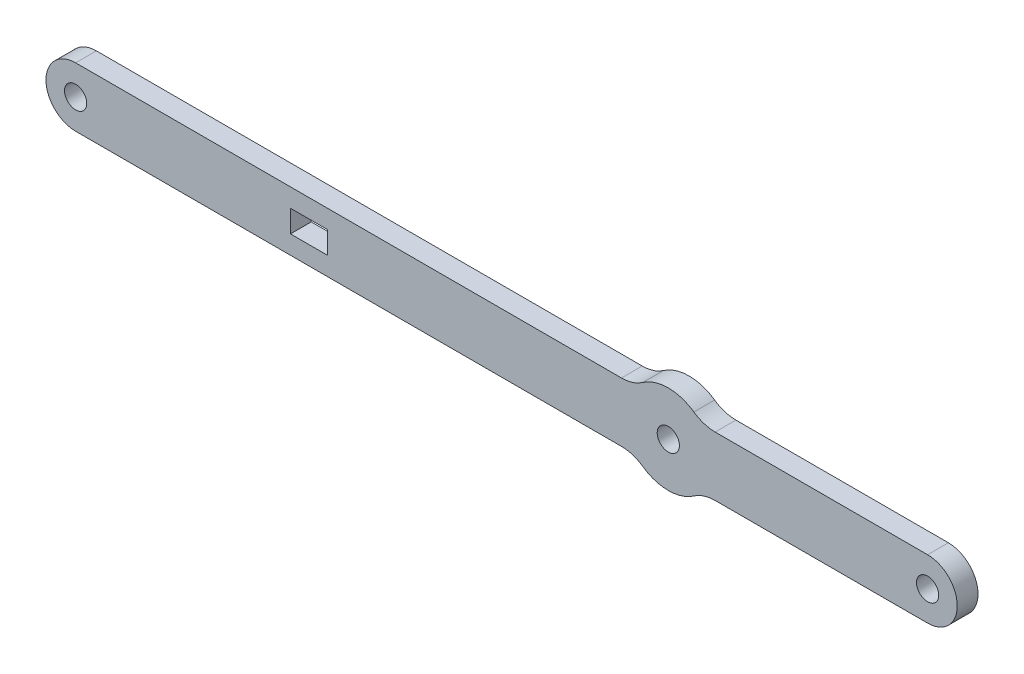
ISO-10303-21;
HEADER;
FILE_DESCRIPTION(('STEP AP214'),'2;1');
FILE_NAME('part.step','',(''),(''),'','','');
FILE_SCHEMA(('AUTOMOTIVE_DESIGN { 1 0 10303 214 1 1 1 1 }'));
ENDSEC;
DATA;
#1=APPLICATION_CONTEXT('core data for automotive mechanical design processes');
#2=APPLICATION_PROTOCOL_DEFINITION('international standard','automotive_design',2000,#1);
#3=PRODUCT_CONTEXT('',#1,'mechanical');
#4=PRODUCT('Part','Part','',(#3));
#5=PRODUCT_RELATED_PRODUCT_CATEGORY('part','',(#4));
#6=PRODUCT_DEFINITION_FORMATION('','',#4);
#7=PRODUCT_DEFINITION_CONTEXT('part definition',#1,'design');
#8=PRODUCT_DEFINITION('design','',#6,#7);
#9=PRODUCT_DEFINITION_SHAPE('','',#8);
#10=(LENGTH_UNIT() NAMED_UNIT(*) SI_UNIT(.MILLI.,.METRE.));
#11=(NAMED_UNIT(*) PLANE_ANGLE_UNIT() SI_UNIT($,.RADIAN.));
#12=(NAMED_UNIT(*) SI_UNIT($,.STERADIAN.) SOLID_ANGLE_UNIT());
#13=UNCERTAINTY_MEASURE_WITH_UNIT(LENGTH_MEASURE(1.E-05),#10,'distance_accuracy_value','');
#14=(GEOMETRIC_REPRESENTATION_CONTEXT(3) GLOBAL_UNCERTAINTY_ASSIGNED_CONTEXT((#13)) GLOBAL_UNIT_ASSIGNED_CONTEXT((#10,
#11,#12)) REPRESENTATION_CONTEXT('',''));
#15=CARTESIAN_POINT('',(0.,0.,0.));
#16=DIRECTION('',(0.,0.,1.));
#17=DIRECTION('',(1.,0.,0.));
#18=AXIS2_PLACEMENT_3D('',#15,#16,#17);
#19=CARTESIAN_POINT('',(0.,0.,2.8));
#20=DIRECTION('',(0.,0.,1.));
#21=DIRECTION('',(1.,0.,0.));
#22=AXIS2_PLACEMENT_3D('',#19,#20,#21);
#23=PLANE('',#22);
#24=CARTESIAN_POINT('',(115.,0.,2.8));
#25=DIRECTION('',(0.,0.,1.));
#26=DIRECTION('',(1.,0.,0.));
#27=AXIS2_PLACEMENT_3D('',#24,#25,#26);
#28=CIRCLE('',#27,1.5);
#29=CARTESIAN_POINT('',(116.5,0.,2.8));
#30=VERTEX_POINT('',#29);
#31=EDGE_CURVE('E196',#30,#30,#28,.T.);
#32=ORIENTED_EDGE('',*,*,#31,.F.);
#33=EDGE_LOOP('',(#32));
#34=FACE_BOUND('',#33,.T.);
#35=CARTESIAN_POINT('',(0.,0.,2.8));
#36=DIRECTION('',(0.,0.,1.));
#37=DIRECTION('',(1.,0.,0.));
#38=AXIS2_PLACEMENT_3D('',#35,#36,#37);
#39=CIRCLE('',#38,4.0000055179048);
#40=CARTESIAN_POINT('',(0.00617437826342593,4.00000075254017,2.8));
#41=VERTEX_POINT('',#40);
#42=CARTESIAN_POINT('',(-0.00708267489475927,-3.99999924737308,2.8));
#43=VERTEX_POINT('',#42);
#44=EDGE_CURVE('E208',#41,#43,#39,.T.);
#45=ORIENTED_EDGE('',*,*,#44,.T.);
#46=DIRECTION('',(1.,-6.54439458712643E-09,0.));
#47=VECTOR('',#46,1.);
#48=CARTESIAN_POINT('',(-0.00708267489475927,-3.99999924737308,2.8));
#49=LINE('',#48,#47);
#50=CARTESIAN_POINT('',(73.6754443275717,-3.99999972958061,2.8));
#51=VERTEX_POINT('',#50);
#52=EDGE_CURVE('E211',#43,#51,#49,.T.);
#53=ORIENTED_EDGE('',*,*,#52,.T.);
#54=CARTESIAN_POINT('',(73.6754442948497,-8.99999972958061,2.8));
#55=DIRECTION('',(0.,0.,1.));
#56=DIRECTION('',(1.,0.,0.));
#57=AXIS2_PLACEMENT_3D('',#54,#55,#56);
#58=CIRCLE('',#57,5.);
#59=CARTESIAN_POINT('',(76.5502423426453,-4.90909076158942,2.8));
#60=VERTEX_POINT('',#59);
#61=EDGE_CURVE('E284',#51,#60,#58,.F.);
#62=ORIENTED_EDGE('',*,*,#61,.T.);
#63=CARTESIAN_POINT('',(80.,0.,2.8));
#64=DIRECTION('',(0.,0.,1.));
#65=DIRECTION('',(1.,0.,0.));
#66=AXIS2_PLACEMENT_3D('',#63,#64,#65);
#67=CIRCLE('',#66,6.);
#68=CARTESIAN_POINT('',(83.4497575931007,-4.90909080674257,2.8));
#69=VERTEX_POINT('',#68);
#70=EDGE_CURVE('E215',#60,#69,#67,.T.);
#71=ORIENTED_EDGE('',*,*,#70,.T.);
#72=CARTESIAN_POINT('',(86.3245555873512,-8.99999981236138,2.8));
#73=DIRECTION('',(0.,0.,1.));
#74=DIRECTION('',(1.,0.,0.));
#75=AXIS2_PLACEMENT_3D('',#72,#73,#74);
#76=CIRCLE('',#75,5.);
#77=CARTESIAN_POINT('',(86.3245556200732,-3.99999981236138,2.8));
#78=VERTEX_POINT('',#77);
#79=EDGE_CURVE('E280',#69,#78,#76,.F.);
#80=ORIENTED_EDGE('',*,*,#79,.T.);
#81=DIRECTION('',(1.,-6.54439462257202E-09,0.));
#82=VECTOR('',#81,1.);
#83=CARTESIAN_POINT('',(84.4721361336718,-3.99999980023842,2.8));
#84=LINE('',#83,#82);
#85=CARTESIAN_POINT('',(114.999999973822,-4.,2.8));
#86=VERTEX_POINT('',#85);
#87=EDGE_CURVE('E218',#78,#86,#84,.T.);
#88=ORIENTED_EDGE('',*,*,#87,.T.);
#89=CARTESIAN_POINT('',(115.,0.,2.8));
#90=DIRECTION('',(0.,0.,1.));
#91=DIRECTION('',(1.,0.,0.));
#92=AXIS2_PLACEMENT_3D('',#89,#90,#91);
#93=CIRCLE('',#92,4.);
#94=CARTESIAN_POINT('',(115.000000078533,3.99999999997519,2.8));
#95=VERTEX_POINT('',#94);
#96=EDGE_CURVE('E220',#86,#95,#93,.T.);
#97=ORIENTED_EDGE('',*,*,#96,.T.);
#98=DIRECTION('',(-1.,6.54439460875569E-09,0.));
#99=VECTOR('',#98,1.);
#100=CARTESIAN_POINT('',(84.4721357763274,4.00000019976158,2.8));
#101=LINE('',#100,#99);
#102=CARTESIAN_POINT('',(86.3245550206003,4.00000018763862,2.8));
#103=VERTEX_POINT('',#102);
#104=EDGE_CURVE('E222',#95,#103,#101,.T.);
#105=ORIENTED_EDGE('',*,*,#104,.T.);
#106=CARTESIAN_POINT('',(86.3245550533223,9.00000018763862,2.8));
#107=DIRECTION('',(0.,0.,1.));
#108=DIRECTION('',(1.,0.,0.));
#109=AXIS2_PLACEMENT_3D('',#106,#107,#108);
#110=CIRCLE('',#109,5.);
#111=CARTESIAN_POINT('',(83.4497573018122,4.90909101143925,2.8));
#112=VERTEX_POINT('',#111);
#113=EDGE_CURVE('E11',#103,#112,#110,.F.);
#114=ORIENTED_EDGE('',*,*,#113,.T.);
#115=CARTESIAN_POINT('',(80.,0.,2.8));
#116=DIRECTION('',(0.,0.,1.));
#117=DIRECTION('',(1.,0.,0.));
#118=AXIS2_PLACEMENT_3D('',#115,#116,#117);
#119=CIRCLE('',#118,6.00000000000001);
#120=CARTESIAN_POINT('',(76.5502427624419,4.90909105659239,2.8));
#121=VERTEX_POINT('',#120);
#122=EDGE_CURVE('E224',#112,#121,#119,.T.);
#123=ORIENTED_EDGE('',*,*,#122,.T.);
#124=CARTESIAN_POINT('',(73.6754450644768,9.00000027041939,2.8));
#125=DIRECTION('',(0.,0.,1.));
#126=DIRECTION('',(1.,0.,0.));
#127=AXIS2_PLACEMENT_3D('',#124,#125,#126);
#128=CIRCLE('',#127,5.);
#129=CARTESIAN_POINT('',(73.6754450317548,4.00000027041939,2.8));
#130=VERTEX_POINT('',#129);
#131=EDGE_CURVE('E288',#121,#130,#128,.F.);
#132=ORIENTED_EDGE('',*,*,#131,.T.);
#133=DIRECTION('',(-1.,6.54439461327344E-09,0.));
#134=VECTOR('',#133,1.);
#135=CARTESIAN_POINT('',(0.00617437826342593,4.00000075254017,2.8));
#136=LINE('',#135,#134);
#137=EDGE_CURVE('E227',#130,#41,#136,.T.);
#138=ORIENTED_EDGE('',*,*,#137,.T.);
#139=EDGE_LOOP('',(#45,#53,#62,#71,#80,#88,#97,#105,#114,#123,#132,#138));
#140=FACE_BOUND('',#139,.T.);
#141=CARTESIAN_POINT('',(80.,0.,2.8));
#142=DIRECTION('',(0.,0.,1.));
#143=DIRECTION('',(1.,0.,0.));
#144=AXIS2_PLACEMENT_3D('',#141,#142,#143);
#145=CIRCLE('',#144,1.5);
#146=CARTESIAN_POINT('',(81.5,0.,2.8));
#147=VERTEX_POINT('',#146);
#148=EDGE_CURVE('E202',#147,#147,#145,.T.);
#149=ORIENTED_EDGE('',*,*,#148,.F.);
#150=EDGE_LOOP('',(#149));
#151=FACE_BOUND('',#150,.T.);
#152=CARTESIAN_POINT('',(0.,0.,2.8));
#153=DIRECTION('',(0.,0.,1.));
#154=DIRECTION('',(1.,0.,0.));
#155=AXIS2_PLACEMENT_3D('',#152,#153,#154);
#156=CIRCLE('',#155,1.5);
#157=CARTESIAN_POINT('',(1.5,0.,2.8));
#158=VERTEX_POINT('',#157);
#159=EDGE_CURVE('E190',#158,#158,#156,.T.);
#160=ORIENTED_EDGE('',*,*,#159,.F.);
#161=EDGE_LOOP('',(#160));
#162=FACE_BOUND('',#161,.T.);
#163=DIRECTION('',(-1.,0.,0.));
#164=VECTOR('',#163,1.);
#165=CARTESIAN_POINT('',(28.999999974262,1.5,2.8));
#166=LINE('',#165,#164);
#167=CARTESIAN_POINT('',(33.999999974262,1.5,2.8));
#168=VERTEX_POINT('',#167);
#169=CARTESIAN_POINT('',(28.999999974262,1.5,2.8));
#170=VERTEX_POINT('',#169);
#171=EDGE_CURVE('E159',#168,#170,#166,.T.);
#172=ORIENTED_EDGE('',*,*,#171,.F.);
#173=DIRECTION('',(0.,1.,0.));
#174=VECTOR('',#173,1.);
#175=CARTESIAN_POINT('',(33.999999974262,-1.5,2.8));
#176=LINE('',#175,#174);
#177=CARTESIAN_POINT('',(33.999999974262,-1.5,2.8));
#178=VERTEX_POINT('',#177);
#179=EDGE_CURVE('E149',#178,#168,#176,.T.);
#180=ORIENTED_EDGE('',*,*,#179,.F.);
#181=DIRECTION('',(1.,0.,0.));
#182=VECTOR('',#181,1.);
#183=CARTESIAN_POINT('',(28.999999974262,-1.5,2.8));
#184=LINE('',#183,#182);
#185=CARTESIAN_POINT('',(28.999999974262,-1.5,2.8));
#186=VERTEX_POINT('',#185);
#187=EDGE_CURVE('E174',#186,#178,#184,.T.);
#188=ORIENTED_EDGE('',*,*,#187,.F.);
#189=DIRECTION('',(0.,-1.,0.));
#190=VECTOR('',#189,1.);
#191=CARTESIAN_POINT('',(28.999999974262,-1.5,2.8));
#192=LINE('',#191,#190);
#193=EDGE_CURVE('E172',#170,#186,#192,.T.);
#194=ORIENTED_EDGE('',*,*,#193,.F.);
#195=EDGE_LOOP('',(#172,#180,#188,#194));
#196=FACE_BOUND('',#195,.T.);
#197=ADVANCED_FACE('F35',(#34,#140,#151,#162,#196),#23,.T.);
#198=CARTESIAN_POINT('',(0.,0.,0.));
#199=DIRECTION('',(0.,0.,1.));
#200=DIRECTION('',(1.,0.,0.));
#201=AXIS2_PLACEMENT_3D('',#198,#199,#200);
#202=PLANE('',#201);
#203=CARTESIAN_POINT('',(0.,0.,0.));
#204=DIRECTION('',(0.,0.,1.));
#205=DIRECTION('',(1.,0.,0.));
#206=AXIS2_PLACEMENT_3D('',#203,#204,#205);
#207=CIRCLE('',#206,1.5);
#208=CARTESIAN_POINT('',(1.5,0.,0.));
#209=VERTEX_POINT('',#208);
#210=EDGE_CURVE('E167',#209,#209,#207,.T.);
#211=ORIENTED_EDGE('',*,*,#210,.T.);
#212=EDGE_LOOP('',(#211));
#213=FACE_BOUND('',#212,.T.);
#214=CARTESIAN_POINT('',(115.,0.,0.));
#215=DIRECTION('',(0.,0.,1.));
#216=DIRECTION('',(1.,0.,0.));
#217=AXIS2_PLACEMENT_3D('',#214,#215,#216);
#218=CIRCLE('',#217,1.5);
#219=CARTESIAN_POINT('',(116.5,0.,0.));
#220=VERTEX_POINT('',#219);
#221=EDGE_CURVE('E193',#220,#220,#218,.T.);
#222=ORIENTED_EDGE('',*,*,#221,.T.);
#223=EDGE_LOOP('',(#222));
#224=FACE_BOUND('',#223,.T.);
#225=CARTESIAN_POINT('',(80.,0.,0.));
#226=DIRECTION('',(0.,0.,1.));
#227=DIRECTION('',(1.,0.,0.));
#228=AXIS2_PLACEMENT_3D('',#225,#226,#227);
#229=CIRCLE('',#228,1.5);
#230=CARTESIAN_POINT('',(81.5,0.,0.));
#231=VERTEX_POINT('',#230);
#232=EDGE_CURVE('E199',#231,#231,#229,.T.);
#233=ORIENTED_EDGE('',*,*,#232,.T.);
#234=EDGE_LOOP('',(#233));
#235=FACE_BOUND('',#234,.T.);
#236=CARTESIAN_POINT('',(0.,0.,0.));
#237=DIRECTION('',(0.,0.,1.));
#238=DIRECTION('',(1.,0.,0.));
#239=AXIS2_PLACEMENT_3D('',#236,#237,#238);
#240=CIRCLE('',#239,4.0000055179048);
#241=CARTESIAN_POINT('',(0.00617437826342593,4.00000075254017,0.));
#242=VERTEX_POINT('',#241);
#243=CARTESIAN_POINT('',(-0.00708267489475927,-3.99999924737308,0.));
#244=VERTEX_POINT('',#243);
#245=EDGE_CURVE('E205',#242,#244,#240,.T.);
#246=ORIENTED_EDGE('',*,*,#245,.F.);
#247=DIRECTION('',(-1.,6.54439461327344E-09,0.));
#248=VECTOR('',#247,1.);
#249=CARTESIAN_POINT('',(0.00617437826342593,4.00000075254017,0.));
#250=LINE('',#249,#248);
#251=CARTESIAN_POINT('',(73.6754450317548,4.00000027041939,0.));
#252=VERTEX_POINT('',#251);
#253=EDGE_CURVE('E212',#252,#242,#250,.T.);
#254=ORIENTED_EDGE('',*,*,#253,.F.);
#255=CARTESIAN_POINT('',(73.6754450644768,9.00000027041939,0.));
#256=DIRECTION('',(0.,0.,1.));
#257=DIRECTION('',(1.,0.,0.));
#258=AXIS2_PLACEMENT_3D('',#255,#256,#257);
#259=CIRCLE('',#258,5.);
#260=CARTESIAN_POINT('',(76.5502427624419,4.90909105659239,0.));
#261=VERTEX_POINT('',#260);
#262=EDGE_CURVE('E286',#252,#261,#259,.T.);
#263=ORIENTED_EDGE('',*,*,#262,.T.);
#264=CARTESIAN_POINT('',(80.,0.,0.));
#265=DIRECTION('',(0.,0.,1.));
#266=DIRECTION('',(1.,0.,0.));
#267=AXIS2_PLACEMENT_3D('',#264,#265,#266);
#268=CIRCLE('',#267,6.00000000000001);
#269=CARTESIAN_POINT('',(83.4497573018122,4.90909101143925,0.));
#270=VERTEX_POINT('',#269);
#271=EDGE_CURVE('E244',#270,#261,#268,.T.);
#272=ORIENTED_EDGE('',*,*,#271,.F.);
#273=CARTESIAN_POINT('',(86.3245550533223,9.00000018763862,0.));
#274=DIRECTION('',(0.,0.,1.));
#275=DIRECTION('',(1.,0.,0.));
#276=AXIS2_PLACEMENT_3D('',#273,#274,#275);
#277=CIRCLE('',#276,5.);
#278=CARTESIAN_POINT('',(86.3245550206003,4.00000018763862,0.));
#279=VERTEX_POINT('',#278);
#280=EDGE_CURVE('E43',#270,#279,#277,.T.);
#281=ORIENTED_EDGE('',*,*,#280,.T.);
#282=DIRECTION('',(-1.,6.54439460875569E-09,0.));
#283=VECTOR('',#282,1.);
#284=CARTESIAN_POINT('',(84.4721357763274,4.00000019976158,0.));
#285=LINE('',#284,#283);
#286=CARTESIAN_POINT('',(115.000000078533,3.99999999997519,0.));
#287=VERTEX_POINT('',#286);
#288=EDGE_CURVE('E242',#287,#279,#285,.T.);
#289=ORIENTED_EDGE('',*,*,#288,.F.);
#290=CARTESIAN_POINT('',(115.,0.,0.));
#291=DIRECTION('',(0.,0.,1.));
#292=DIRECTION('',(1.,0.,0.));
#293=AXIS2_PLACEMENT_3D('',#290,#291,#292);
#294=CIRCLE('',#293,4.);
#295=CARTESIAN_POINT('',(114.999999973822,-4.,0.));
#296=VERTEX_POINT('',#295);
#297=EDGE_CURVE('E240',#296,#287,#294,.T.);
#298=ORIENTED_EDGE('',*,*,#297,.F.);
#299=DIRECTION('',(1.,-6.54439462257202E-09,0.));
#300=VECTOR('',#299,1.);
#301=CARTESIAN_POINT('',(84.4721361336718,-3.99999980023842,0.));
#302=LINE('',#301,#300);
#303=CARTESIAN_POINT('',(86.3245556200732,-3.99999981236138,0.));
#304=VERTEX_POINT('',#303);
#305=EDGE_CURVE('E238',#304,#296,#302,.T.);
#306=ORIENTED_EDGE('',*,*,#305,.F.);
#307=CARTESIAN_POINT('',(86.3245555873512,-8.99999981236138,0.));
#308=DIRECTION('',(0.,0.,1.));
#309=DIRECTION('',(1.,0.,0.));
#310=AXIS2_PLACEMENT_3D('',#307,#308,#309);
#311=CIRCLE('',#310,5.);
#312=CARTESIAN_POINT('',(83.4497575931007,-4.90909080674257,0.));
#313=VERTEX_POINT('',#312);
#314=EDGE_CURVE('E278',#304,#313,#311,.T.);
#315=ORIENTED_EDGE('',*,*,#314,.T.);
#316=CARTESIAN_POINT('',(80.,0.,0.));
#317=DIRECTION('',(0.,0.,1.));
#318=DIRECTION('',(1.,0.,0.));
#319=AXIS2_PLACEMENT_3D('',#316,#317,#318);
#320=CIRCLE('',#319,6.);
#321=CARTESIAN_POINT('',(76.5502423426453,-4.90909076158942,0.));
#322=VERTEX_POINT('',#321);
#323=EDGE_CURVE('E235',#322,#313,#320,.T.);
#324=ORIENTED_EDGE('',*,*,#323,.F.);
#325=CARTESIAN_POINT('',(73.6754442948497,-8.99999972958061,0.));
#326=DIRECTION('',(0.,0.,1.));
#327=DIRECTION('',(1.,0.,0.));
#328=AXIS2_PLACEMENT_3D('',#325,#326,#327);
#329=CIRCLE('',#328,5.);
#330=CARTESIAN_POINT('',(73.6754443275717,-3.99999972958061,0.));
#331=VERTEX_POINT('',#330);
#332=EDGE_CURVE('E282',#322,#331,#329,.T.);
#333=ORIENTED_EDGE('',*,*,#332,.T.);
#334=DIRECTION('',(1.,-6.54439458712643E-09,0.));
#335=VECTOR('',#334,1.);
#336=CARTESIAN_POINT('',(-0.00708267489475927,-3.99999924737308,0.));
#337=LINE('',#336,#335);
#338=EDGE_CURVE('E232',#244,#331,#337,.T.);
#339=ORIENTED_EDGE('',*,*,#338,.F.);
#340=EDGE_LOOP('',(#246,#254,#263,#272,#281,#289,#298,#306,#315,#324,#333,#339));
#341=FACE_BOUND('',#340,.T.);
#342=DIRECTION('',(0.,1.,0.));
#343=VECTOR('',#342,1.);
#344=CARTESIAN_POINT('',(33.999999974262,-1.5,0.));
#345=LINE('',#344,#343);
#346=CARTESIAN_POINT('',(33.999999974262,-1.5,0.));
#347=VERTEX_POINT('',#346);
#348=CARTESIAN_POINT('',(33.999999974262,1.5,0.));
#349=VERTEX_POINT('',#348);
#350=EDGE_CURVE('E178',#347,#349,#345,.T.);
#351=ORIENTED_EDGE('',*,*,#350,.T.);
#352=DIRECTION('',(-1.,0.,0.));
#353=VECTOR('',#352,1.);
#354=CARTESIAN_POINT('',(28.999999974262,1.5,0.));
#355=LINE('',#354,#353);
#356=CARTESIAN_POINT('',(28.999999974262,1.5,0.));
#357=VERTEX_POINT('',#356);
#358=EDGE_CURVE('E166',#349,#357,#355,.T.);
#359=ORIENTED_EDGE('',*,*,#358,.T.);
#360=DIRECTION('',(0.,-1.,0.));
#361=VECTOR('',#360,1.);
#362=CARTESIAN_POINT('',(28.999999974262,-1.5,0.));
#363=LINE('',#362,#361);
#364=CARTESIAN_POINT('',(28.999999974262,-1.5,0.));
#365=VERTEX_POINT('',#364);
#366=EDGE_CURVE('E181',#357,#365,#363,.T.);
#367=ORIENTED_EDGE('',*,*,#366,.T.);
#368=DIRECTION('',(1.,0.,0.));
#369=VECTOR('',#368,1.);
#370=CARTESIAN_POINT('',(28.999999974262,-1.5,0.));
#371=LINE('',#370,#369);
#372=EDGE_CURVE('E160',#365,#347,#371,.T.);
#373=ORIENTED_EDGE('',*,*,#372,.T.);
#374=EDGE_LOOP('',(#351,#359,#367,#373));
#375=FACE_BOUND('',#374,.T.);
#376=ADVANCED_FACE('F304',(#213,#224,#235,#341,#375),#202,.F.);
#377=CARTESIAN_POINT('',(0.,0.,2.8));
#378=DIRECTION('',(0.,0.,-1.));
#379=DIRECTION('',(-1.,0.,0.));
#380=AXIS2_PLACEMENT_3D('',#377,#378,#379);
#381=CYLINDRICAL_SURFACE('',#380,4.0000055179048);
#382=ORIENTED_EDGE('',*,*,#245,.T.);
#383=DIRECTION('',(0.,0.,-1.));
#384=VECTOR('',#383,1.);
#385=CARTESIAN_POINT('',(-0.00708267489475927,-3.99999924737308,2.8));
#386=LINE('',#385,#384);
#387=EDGE_CURVE('E256',#43,#244,#386,.T.);
#388=ORIENTED_EDGE('',*,*,#387,.F.);
#389=ORIENTED_EDGE('',*,*,#44,.F.);
#390=DIRECTION('',(0.,0.,-1.));
#391=VECTOR('',#390,1.);
#392=CARTESIAN_POINT('',(0.00617437826342593,4.00000075254017,2.8));
#393=LINE('',#392,#391);
#394=EDGE_CURVE('E229',#41,#242,#393,.T.);
#395=ORIENTED_EDGE('',*,*,#394,.T.);
#396=EDGE_LOOP('',(#382,#388,#389,#395));
#397=FACE_BOUND('',#396,.T.);
#398=ADVANCED_FACE('F340',(#397),#381,.T.);
#399=CARTESIAN_POINT('',(-0.00708267489475927,-3.99999924737308,2.8));
#400=DIRECTION('',(6.54439458712643E-09,1.,0.));
#401=DIRECTION('',(-1.,6.54439458712643E-09,0.));
#402=AXIS2_PLACEMENT_3D('',#399,#400,#401);
#403=PLANE('',#402);
#404=ORIENTED_EDGE('',*,*,#338,.T.);
#405=DIRECTION('',(0.,0.,1.));
#406=VECTOR('',#405,1.);
#407=CARTESIAN_POINT('',(73.6754443275717,-3.99999972958061,2.8));
#408=LINE('',#407,#406);
#409=EDGE_CURVE('E267',#331,#51,#408,.T.);
#410=ORIENTED_EDGE('',*,*,#409,.T.);
#411=ORIENTED_EDGE('',*,*,#52,.F.);
#412=ORIENTED_EDGE('',*,*,#387,.T.);
#413=EDGE_LOOP('',(#404,#410,#411,#412));
#414=FACE_BOUND('',#413,.T.);
#415=ADVANCED_FACE('F337',(#414),#403,.F.);
#416=CARTESIAN_POINT('',(80.,0.,2.8));
#417=DIRECTION('',(0.,0.,-1.));
#418=DIRECTION('',(-1.,0.,0.));
#419=AXIS2_PLACEMENT_3D('',#416,#417,#418);
#420=CYLINDRICAL_SURFACE('',#419,6.);
#421=ORIENTED_EDGE('',*,*,#323,.T.);
#422=DIRECTION('',(0.,0.,-1.));
#423=VECTOR('',#422,1.);
#424=CARTESIAN_POINT('',(83.4497575931007,-4.90909080674258,2.8));
#425=LINE('',#424,#423);
#426=EDGE_CURVE('E265',#313,#69,#425,.F.);
#427=ORIENTED_EDGE('',*,*,#426,.T.);
#428=ORIENTED_EDGE('',*,*,#70,.F.);
#429=DIRECTION('',(0.,0.,-1.));
#430=VECTOR('',#429,1.);
#431=CARTESIAN_POINT('',(76.5502423426453,-4.90909076158942,2.8));
#432=LINE('',#431,#430);
#433=EDGE_CURVE('E262',#60,#322,#432,.T.);
#434=ORIENTED_EDGE('',*,*,#433,.T.);
#435=EDGE_LOOP('',(#421,#427,#428,#434));
#436=FACE_BOUND('',#435,.T.);
#437=ADVANCED_FACE('F329',(#436),#420,.T.);
#438=CARTESIAN_POINT('',(84.4721361336718,-3.99999980023842,2.8));
#439=DIRECTION('',(6.54439462257202E-09,1.,0.));
#440=DIRECTION('',(-1.,6.54439462257202E-09,0.));
#441=AXIS2_PLACEMENT_3D('',#438,#439,#440);
#442=PLANE('',#441);
#443=ORIENTED_EDGE('',*,*,#87,.F.);
#444=DIRECTION('',(0.,0.,1.));
#445=VECTOR('',#444,1.);
#446=CARTESIAN_POINT('',(86.3245556200732,-3.99999981236138,0.));
#447=LINE('',#446,#445);
#448=EDGE_CURVE('E259',#78,#304,#447,.F.);
#449=ORIENTED_EDGE('',*,*,#448,.T.);
#450=ORIENTED_EDGE('',*,*,#305,.T.);
#451=DIRECTION('',(0.,0.,-1.));
#452=VECTOR('',#451,1.);
#453=CARTESIAN_POINT('',(114.999999973822,-4.,2.8));
#454=LINE('',#453,#452);
#455=EDGE_CURVE('E253',#86,#296,#454,.T.);
#456=ORIENTED_EDGE('',*,*,#455,.F.);
#457=EDGE_LOOP('',(#443,#449,#450,#456));
#458=FACE_BOUND('',#457,.T.);
#459=ADVANCED_FACE('F321',(#458),#442,.F.);
#460=CARTESIAN_POINT('',(115.,0.,2.8));
#461=DIRECTION('',(0.,0.,-1.));
#462=DIRECTION('',(-1.,0.,0.));
#463=AXIS2_PLACEMENT_3D('',#460,#461,#462);
#464=CYLINDRICAL_SURFACE('',#463,4.);
#465=ORIENTED_EDGE('',*,*,#297,.T.);
#466=DIRECTION('',(0.,0.,-1.));
#467=VECTOR('',#466,1.);
#468=CARTESIAN_POINT('',(115.000000078533,3.99999999997519,2.8));
#469=LINE('',#468,#467);
#470=EDGE_CURVE('E250',#95,#287,#469,.T.);
#471=ORIENTED_EDGE('',*,*,#470,.F.);
#472=ORIENTED_EDGE('',*,*,#96,.F.);
#473=ORIENTED_EDGE('',*,*,#455,.T.);
#474=EDGE_LOOP('',(#465,#471,#472,#473));
#475=FACE_BOUND('',#474,.T.);
#476=ADVANCED_FACE('F317',(#475),#464,.T.);
#477=CARTESIAN_POINT('',(84.4721357763274,4.00000019976158,2.8));
#478=DIRECTION('',(-6.54439460875569E-09,-1.,0.));
#479=DIRECTION('',(1.,-6.54439460875569E-09,0.));
#480=AXIS2_PLACEMENT_3D('',#477,#478,#479);
#481=PLANE('',#480);
#482=ORIENTED_EDGE('',*,*,#288,.T.);
#483=DIRECTION('',(0.,0.,1.));
#484=VECTOR('',#483,1.);
#485=CARTESIAN_POINT('',(86.3245550206003,4.00000018763862,2.8));
#486=LINE('',#485,#484);
#487=EDGE_CURVE('E50',#279,#103,#486,.T.);
#488=ORIENTED_EDGE('',*,*,#487,.T.);
#489=ORIENTED_EDGE('',*,*,#104,.F.);
#490=ORIENTED_EDGE('',*,*,#470,.T.);
#491=EDGE_LOOP('',(#482,#488,#489,#490));
#492=FACE_BOUND('',#491,.T.);
#493=ADVANCED_FACE('F313',(#492),#481,.F.);
#494=CARTESIAN_POINT('',(80.,0.,2.8));
#495=DIRECTION('',(0.,0.,-1.));
#496=DIRECTION('',(-1.,0.,0.));
#497=AXIS2_PLACEMENT_3D('',#494,#495,#496);
#498=CYLINDRICAL_SURFACE('',#497,6.00000000000001);
#499=ORIENTED_EDGE('',*,*,#271,.T.);
#500=DIRECTION('',(0.,0.,-1.));
#501=VECTOR('',#500,1.);
#502=CARTESIAN_POINT('',(76.5502427624419,4.90909105659239,2.8));
#503=LINE('',#502,#501);
#504=EDGE_CURVE('E275',#261,#121,#503,.F.);
#505=ORIENTED_EDGE('',*,*,#504,.T.);
#506=ORIENTED_EDGE('',*,*,#122,.F.);
#507=DIRECTION('',(0.,0.,-1.));
#508=VECTOR('',#507,1.);
#509=CARTESIAN_POINT('',(83.4497573018122,4.90909101143925,2.8));
#510=LINE('',#509,#508);
#511=EDGE_CURVE('E272',#112,#270,#510,.T.);
#512=ORIENTED_EDGE('',*,*,#511,.T.);
#513=EDGE_LOOP('',(#499,#505,#506,#512));
#514=FACE_BOUND('',#513,.T.);
#515=ADVANCED_FACE('F307',(#514),#498,.T.);
#516=CARTESIAN_POINT('',(0.00617437826342593,4.00000075254017,2.8));
#517=DIRECTION('',(-6.54439461327344E-09,-1.,0.));
#518=DIRECTION('',(1.,-6.54439461327344E-09,0.));
#519=AXIS2_PLACEMENT_3D('',#516,#517,#518);
#520=PLANE('',#519);
#521=ORIENTED_EDGE('',*,*,#137,.F.);
#522=DIRECTION('',(0.,0.,1.));
#523=VECTOR('',#522,1.);
#524=CARTESIAN_POINT('',(73.6754450317548,4.00000027041939,0.));
#525=LINE('',#524,#523);
#526=EDGE_CURVE('E269',#130,#252,#525,.F.);
#527=ORIENTED_EDGE('',*,*,#526,.T.);
#528=ORIENTED_EDGE('',*,*,#253,.T.);
#529=ORIENTED_EDGE('',*,*,#394,.F.);
#530=EDGE_LOOP('',(#521,#527,#528,#529));
#531=FACE_BOUND('',#530,.T.);
#532=ADVANCED_FACE('F299',(#531),#520,.F.);
#533=CARTESIAN_POINT('',(80.,0.,2.8));
#534=DIRECTION('',(0.,0.,-1.));
#535=DIRECTION('',(-1.,0.,0.));
#536=AXIS2_PLACEMENT_3D('',#533,#534,#535);
#537=CYLINDRICAL_SURFACE('',#536,1.5);
#538=ORIENTED_EDGE('',*,*,#148,.T.);
#539=EDGE_LOOP('',(#538));
#540=FACE_BOUND('',#539,.T.);
#541=ORIENTED_EDGE('',*,*,#232,.F.);
#542=EDGE_LOOP('',(#541));
#543=FACE_BOUND('',#542,.T.);
#544=ADVANCED_FACE('F358',(#540,#543),#537,.F.);
#545=CARTESIAN_POINT('',(115.,0.,2.8));
#546=DIRECTION('',(0.,0.,-1.));
#547=DIRECTION('',(-1.,0.,0.));
#548=AXIS2_PLACEMENT_3D('',#545,#546,#547);
#549=CYLINDRICAL_SURFACE('',#548,1.5);
#550=ORIENTED_EDGE('',*,*,#31,.T.);
#551=EDGE_LOOP('',(#550));
#552=FACE_BOUND('',#551,.T.);
#553=ORIENTED_EDGE('',*,*,#221,.F.);
#554=EDGE_LOOP('',(#553));
#555=FACE_BOUND('',#554,.T.);
#556=ADVANCED_FACE('F403',(#552,#555),#549,.F.);
#557=CARTESIAN_POINT('',(0.,0.,2.8));
#558=DIRECTION('',(0.,0.,-1.));
#559=DIRECTION('',(-1.,0.,0.));
#560=AXIS2_PLACEMENT_3D('',#557,#558,#559);
#561=CYLINDRICAL_SURFACE('',#560,1.5);
#562=ORIENTED_EDGE('',*,*,#159,.T.);
#563=EDGE_LOOP('',(#562));
#564=FACE_BOUND('',#563,.T.);
#565=ORIENTED_EDGE('',*,*,#210,.F.);
#566=EDGE_LOOP('',(#565));
#567=FACE_BOUND('',#566,.T.);
#568=ADVANCED_FACE('F410',(#564,#567),#561,.F.);
#569=CARTESIAN_POINT('',(33.999999974262,-1.5,2.8));
#570=DIRECTION('',(-1.,0.,0.));
#571=DIRECTION('',(0.,-1.,0.));
#572=AXIS2_PLACEMENT_3D('',#569,#570,#571);
#573=PLANE('',#572);
#574=ORIENTED_EDGE('',*,*,#350,.F.);
#575=DIRECTION('',(0.,0.,-1.));
#576=VECTOR('',#575,1.);
#577=CARTESIAN_POINT('',(33.999999974262,-1.5,2.8));
#578=LINE('',#577,#576);
#579=EDGE_CURVE('E155',#178,#347,#578,.T.);
#580=ORIENTED_EDGE('',*,*,#579,.F.);
#581=ORIENTED_EDGE('',*,*,#179,.T.);
#582=DIRECTION('',(0.,0.,-1.));
#583=VECTOR('',#582,1.);
#584=CARTESIAN_POINT('',(33.999999974262,1.5,2.8));
#585=LINE('',#584,#583);
#586=EDGE_CURVE('E152',#168,#349,#585,.T.);
#587=ORIENTED_EDGE('',*,*,#586,.T.);
#588=EDGE_LOOP('',(#574,#580,#581,#587));
#589=FACE_BOUND('',#588,.T.);
#590=ADVANCED_FACE('F151',(#589),#573,.T.);
#591=CARTESIAN_POINT('',(28.999999974262,1.5,2.8));
#592=DIRECTION('',(0.,-1.,0.));
#593=DIRECTION('',(1.,0.,0.));
#594=AXIS2_PLACEMENT_3D('',#591,#592,#593);
#595=PLANE('',#594);
#596=ORIENTED_EDGE('',*,*,#358,.F.);
#597=ORIENTED_EDGE('',*,*,#586,.F.);
#598=ORIENTED_EDGE('',*,*,#171,.T.);
#599=DIRECTION('',(0.,0.,-1.));
#600=VECTOR('',#599,1.);
#601=CARTESIAN_POINT('',(28.999999974262,1.5,2.8));
#602=LINE('',#601,#600);
#603=EDGE_CURVE('E168',#170,#357,#602,.T.);
#604=ORIENTED_EDGE('',*,*,#603,.T.);
#605=EDGE_LOOP('',(#596,#597,#598,#604));
#606=FACE_BOUND('',#605,.T.);
#607=ADVANCED_FACE('F163',(#606),#595,.T.);
#608=CARTESIAN_POINT('',(28.999999974262,-1.5,2.8));
#609=DIRECTION('',(1.,0.,0.));
#610=DIRECTION('',(0.,1.,0.));
#611=AXIS2_PLACEMENT_3D('',#608,#609,#610);
#612=PLANE('',#611);
#613=ORIENTED_EDGE('',*,*,#366,.F.);
#614=ORIENTED_EDGE('',*,*,#603,.F.);
#615=ORIENTED_EDGE('',*,*,#193,.T.);
#616=DIRECTION('',(0.,0.,-1.));
#617=VECTOR('',#616,1.);
#618=CARTESIAN_POINT('',(28.999999974262,-1.5,2.8));
#619=LINE('',#618,#617);
#620=EDGE_CURVE('E187',#186,#365,#619,.T.);
#621=ORIENTED_EDGE('',*,*,#620,.T.);
#622=EDGE_LOOP('',(#613,#614,#615,#621));
#623=FACE_BOUND('',#622,.T.);
#624=ADVANCED_FACE('F430',(#623),#612,.T.);
#625=CARTESIAN_POINT('',(28.999999974262,-1.5,2.8));
#626=DIRECTION('',(0.,1.,0.));
#627=DIRECTION('',(0.,0.,1.));
#628=AXIS2_PLACEMENT_3D('',#625,#626,#627);
#629=PLANE('',#628);
#630=ORIENTED_EDGE('',*,*,#372,.F.);
#631=ORIENTED_EDGE('',*,*,#620,.F.);
#632=ORIENTED_EDGE('',*,*,#187,.T.);
#633=ORIENTED_EDGE('',*,*,#579,.T.);
#634=EDGE_LOOP('',(#630,#631,#632,#633));
#635=FACE_BOUND('',#634,.T.);
#636=ADVANCED_FACE('F437',(#635),#629,.T.);
#637=CARTESIAN_POINT('',(86.3245555873512,-8.99999981236138,2.8));
#638=DIRECTION('',(0.,0.,-1.));
#639=DIRECTION('',(-1.,0.,0.));
#640=AXIS2_PLACEMENT_3D('',#637,#638,#639);
#641=CYLINDRICAL_SURFACE('',#640,5.);
#642=ORIENTED_EDGE('',*,*,#79,.F.);
#643=ORIENTED_EDGE('',*,*,#426,.F.);
#644=ORIENTED_EDGE('',*,*,#314,.F.);
#645=ORIENTED_EDGE('',*,*,#448,.F.);
#646=EDGE_LOOP('',(#642,#643,#644,#645));
#647=FACE_BOUND('',#646,.T.);
#648=ADVANCED_FACE('F325',(#647),#641,.F.);
#649=CARTESIAN_POINT('',(73.6754442948497,-8.99999972958061,2.8));
#650=DIRECTION('',(0.,0.,-1.));
#651=DIRECTION('',(-1.,0.,0.));
#652=AXIS2_PLACEMENT_3D('',#649,#650,#651);
#653=CYLINDRICAL_SURFACE('',#652,5.);
#654=ORIENTED_EDGE('',*,*,#61,.F.);
#655=ORIENTED_EDGE('',*,*,#409,.F.);
#656=ORIENTED_EDGE('',*,*,#332,.F.);
#657=ORIENTED_EDGE('',*,*,#433,.F.);
#658=EDGE_LOOP('',(#654,#655,#656,#657));
#659=FACE_BOUND('',#658,.T.);
#660=ADVANCED_FACE('F334',(#659),#653,.F.);
#661=CARTESIAN_POINT('',(73.6754450644768,9.00000027041939,2.8));
#662=DIRECTION('',(0.,0.,-1.));
#663=DIRECTION('',(-1.,0.,0.));
#664=AXIS2_PLACEMENT_3D('',#661,#662,#663);
#665=CYLINDRICAL_SURFACE('',#664,5.);
#666=ORIENTED_EDGE('',*,*,#131,.F.);
#667=ORIENTED_EDGE('',*,*,#504,.F.);
#668=ORIENTED_EDGE('',*,*,#262,.F.);
#669=ORIENTED_EDGE('',*,*,#526,.F.);
#670=EDGE_LOOP('',(#666,#667,#668,#669));
#671=FACE_BOUND('',#670,.T.);
#672=ADVANCED_FACE('F302',(#671),#665,.F.);
#673=CARTESIAN_POINT('',(86.3245550533223,9.00000018763862,2.8));
#674=DIRECTION('',(0.,0.,-1.));
#675=DIRECTION('',(-1.,0.,0.));
#676=AXIS2_PLACEMENT_3D('',#673,#674,#675);
#677=CYLINDRICAL_SURFACE('',#676,5.);
#678=ORIENTED_EDGE('',*,*,#113,.F.);
#679=ORIENTED_EDGE('',*,*,#487,.F.);
#680=ORIENTED_EDGE('',*,*,#280,.F.);
#681=ORIENTED_EDGE('',*,*,#511,.F.);
#682=EDGE_LOOP('',(#678,#679,#680,#681));
#683=FACE_BOUND('',#682,.T.);
#684=ADVANCED_FACE('F37',(#683),#677,.F.);
#685=CLOSED_SHELL('',(#197,#376,#398,#415,#437,#459,#476,#493,#515,#532,#544,#556,#568,#590,
#607,#624,#636,#648,#660,#672,#684));
#686=MANIFOLD_SOLID_BREP('B2',#685);
#687=ADVANCED_BREP_SHAPE_REPRESENTATION('',(#18,#686),#14);
#688=SHAPE_DEFINITION_REPRESENTATION(#9,#687);
ENDSEC;
END-ISO-10303-21;
